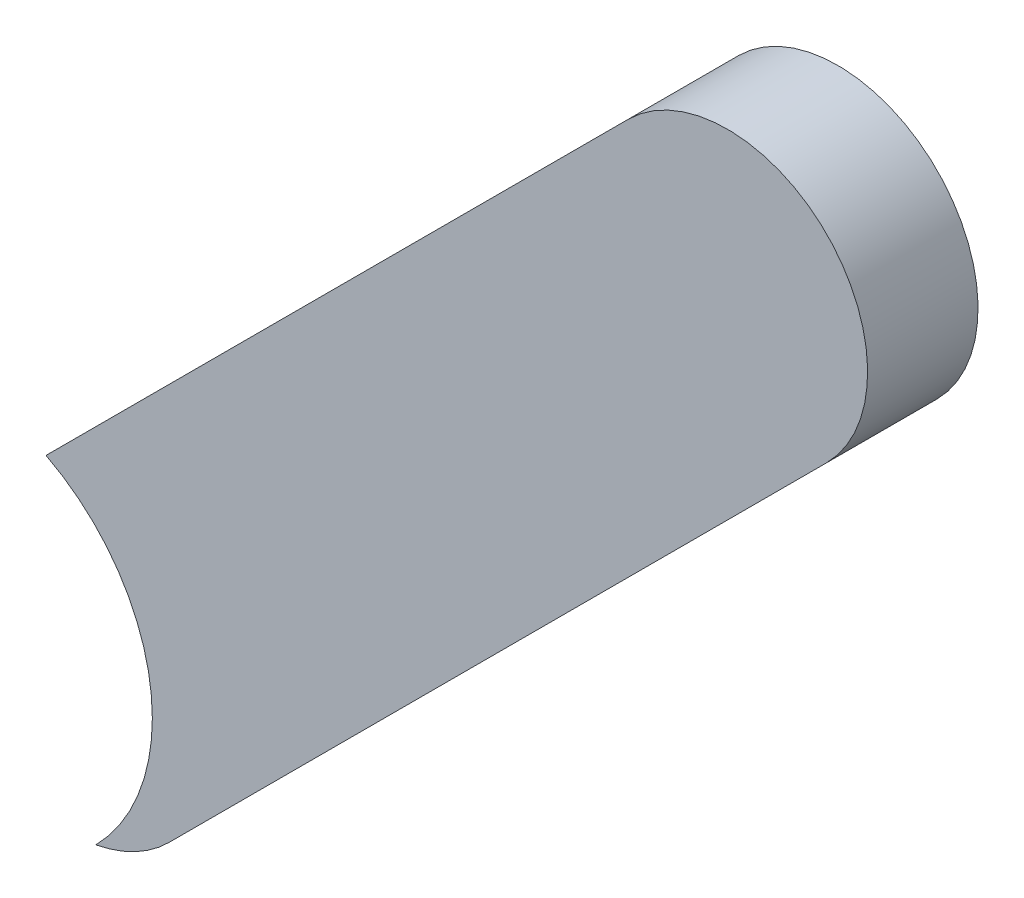
ISO-10303-21;
HEADER;
FILE_DESCRIPTION(('STEP AP214'),'2;1');
FILE_NAME('part.step','',(''),(''),'','','');
FILE_SCHEMA(('AUTOMOTIVE_DESIGN { 1 0 10303 214 1 1 1 1 }'));
ENDSEC;
DATA;
#1=APPLICATION_CONTEXT('core data for automotive mechanical design processes');
#2=APPLICATION_PROTOCOL_DEFINITION('international standard','automotive_design',2000,#1);
#3=PRODUCT_CONTEXT('',#1,'mechanical');
#4=PRODUCT('Part','Part','',(#3));
#5=PRODUCT_RELATED_PRODUCT_CATEGORY('part','',(#4));
#6=PRODUCT_DEFINITION_FORMATION('','',#4);
#7=PRODUCT_DEFINITION_CONTEXT('part definition',#1,'design');
#8=PRODUCT_DEFINITION('design','',#6,#7);
#9=PRODUCT_DEFINITION_SHAPE('','',#8);
#10=(LENGTH_UNIT() NAMED_UNIT(*) SI_UNIT(.MILLI.,.METRE.));
#11=(NAMED_UNIT(*) PLANE_ANGLE_UNIT() SI_UNIT($,.RADIAN.));
#12=(NAMED_UNIT(*) SI_UNIT($,.STERADIAN.) SOLID_ANGLE_UNIT());
#13=UNCERTAINTY_MEASURE_WITH_UNIT(LENGTH_MEASURE(1.E-05),#10,'distance_accuracy_value','');
#14=(GEOMETRIC_REPRESENTATION_CONTEXT(3) GLOBAL_UNCERTAINTY_ASSIGNED_CONTEXT((#13)) GLOBAL_UNIT_ASSIGNED_CONTEXT((#10,
#11,#12)) REPRESENTATION_CONTEXT('',''));
#15=CARTESIAN_POINT('',(0.,0.,0.));
#16=DIRECTION('',(0.,0.,1.));
#17=DIRECTION('',(1.,0.,0.));
#18=AXIS2_PLACEMENT_3D('',#15,#16,#17);
#19=CARTESIAN_POINT('',(136.5298006,68.90839406,0.));
#20=DIRECTION('',(-0.707106781186556,0.707106781186539,0.));
#21=DIRECTION('',(0.707106781186539,0.707106781186556,0.));
#22=AXIS2_PLACEMENT_3D('',#19,#20,#21);
#23=PLANE('',#22);
#24=DIRECTION('',(0.707106781186539,0.707106781186556,0.));
#25=VECTOR('',#24,1.);
#26=CARTESIAN_POINT('',(136.5298006,68.90839406,0.1999996));
#27=LINE('',#26,#25);
#28=CARTESIAN_POINT('',(136.5298006,68.90839406,0.1999996));
#29=VERTEX_POINT('',#28);
#30=CARTESIAN_POINT('',(137.72060594,70.0991994,0.1999996));
#31=VERTEX_POINT('',#30);
#32=EDGE_CURVE('E11',#29,#31,#27,.T.);
#33=ORIENTED_EDGE('',*,*,#32,.F.);
#34=DIRECTION('',(0.,0.,1.));
#35=VECTOR('',#34,1.);
#36=CARTESIAN_POINT('',(136.5298006,68.90839406,0.));
#37=LINE('',#36,#35);
#38=CARTESIAN_POINT('',(136.5298006,68.90839406,0.));
#39=VERTEX_POINT('',#38);
#40=EDGE_CURVE('E24',#39,#29,#37,.T.);
#41=ORIENTED_EDGE('',*,*,#40,.F.);
#42=DIRECTION('',(0.707106781186539,0.707106781186556,0.));
#43=VECTOR('',#42,1.);
#44=CARTESIAN_POINT('',(136.5298006,68.90839406,0.));
#45=LINE('',#44,#43);
#46=CARTESIAN_POINT('',(137.72060594,70.0991994,0.));
#47=VERTEX_POINT('',#46);
#48=EDGE_CURVE('E89',#39,#47,#45,.T.);
#49=ORIENTED_EDGE('',*,*,#48,.T.);
#50=DIRECTION('',(0.,0.,1.));
#51=VECTOR('',#50,1.);
#52=CARTESIAN_POINT('',(137.72060594,70.0991994,0.));
#53=LINE('',#52,#51);
#54=EDGE_CURVE('E37',#47,#31,#53,.T.);
#55=ORIENTED_EDGE('',*,*,#54,.T.);
#56=EDGE_LOOP('',(#33,#41,#49,#55));
#57=FACE_BOUND('',#56,.T.);
#58=ADVANCED_FACE('F17',(#57),#23,.F.);
#59=CARTESIAN_POINT('',(137.541,70.27880534,0.));
#60=DIRECTION('',(0.,0.,-1.));
#61=DIRECTION('',(0.70710678118652,-0.707106781186576,0.));
#62=AXIS2_PLACEMENT_3D('',#59,#60,#61);
#63=CYLINDRICAL_SURFACE('',#62,0.254001156230774);
#64=CARTESIAN_POINT('',(137.541,70.27880534,0.1999996));
#65=DIRECTION('',(0.,0.,1.));
#66=DIRECTION('',(0.70710678118652,-0.707106781186576,0.));
#67=AXIS2_PLACEMENT_3D('',#64,#65,#66);
#68=CIRCLE('',#67,0.254001156230774);
#69=CARTESIAN_POINT('',(137.36139406,70.45841128,0.1999996));
#70=VERTEX_POINT('',#69);
#71=EDGE_CURVE('E111',#31,#70,#68,.T.);
#72=ORIENTED_EDGE('',*,*,#71,.F.);
#73=ORIENTED_EDGE('',*,*,#54,.F.);
#74=CARTESIAN_POINT('',(137.541,70.27880534,0.));
#75=DIRECTION('',(0.,0.,1.));
#76=DIRECTION('',(0.70710678118652,-0.707106781186576,0.));
#77=AXIS2_PLACEMENT_3D('',#74,#75,#76);
#78=CIRCLE('',#77,0.254001156230774);
#79=CARTESIAN_POINT('',(137.36139406,70.45841128,0.));
#80=VERTEX_POINT('',#79);
#81=EDGE_CURVE('E108',#47,#80,#78,.T.);
#82=ORIENTED_EDGE('',*,*,#81,.T.);
#83=DIRECTION('',(0.,0.,1.));
#84=VECTOR('',#83,1.);
#85=CARTESIAN_POINT('',(137.36139406,70.45841128,0.));
#86=LINE('',#85,#84);
#87=EDGE_CURVE('E106',#80,#70,#86,.T.);
#88=ORIENTED_EDGE('',*,*,#87,.T.);
#89=EDGE_LOOP('',(#72,#73,#82,#88));
#90=FACE_BOUND('',#89,.T.);
#91=ADVANCED_FACE('F118',(#90),#63,.T.);
#92=CARTESIAN_POINT('',(137.36139406,70.45841128,0.));
#93=DIRECTION('',(0.70710678118656,-0.707106781186535,0.));
#94=DIRECTION('',(-0.707106781186535,-0.70710678118656,0.));
#95=AXIS2_PLACEMENT_3D('',#92,#93,#94);
#96=PLANE('',#95);
#97=DIRECTION('',(-0.707106781186535,-0.70710678118656,0.));
#98=VECTOR('',#97,1.);
#99=CARTESIAN_POINT('',(137.36139406,70.45841128,0.1999996));
#100=LINE('',#99,#98);
#101=CARTESIAN_POINT('',(136.307016154056,69.4040333740555,0.1999996));
#102=VERTEX_POINT('',#101);
#103=EDGE_CURVE('E103',#70,#102,#100,.T.);
#104=ORIENTED_EDGE('',*,*,#103,.F.);
#105=ORIENTED_EDGE('',*,*,#87,.F.);
#106=DIRECTION('',(-0.707106781186535,-0.70710678118656,0.));
#107=VECTOR('',#106,1.);
#108=CARTESIAN_POINT('',(137.36139406,70.45841128,0.));
#109=LINE('',#108,#107);
#110=CARTESIAN_POINT('',(136.307016154056,69.4040333740555,0.));
#111=VERTEX_POINT('',#110);
#112=EDGE_CURVE('E100',#80,#111,#109,.T.);
#113=ORIENTED_EDGE('',*,*,#112,.T.);
#114=DIRECTION('',(0.,0.,1.));
#115=VECTOR('',#114,1.);
#116=CARTESIAN_POINT('',(136.307016154056,69.4040333740555,0.));
#117=LINE('',#116,#115);
#118=EDGE_CURVE('E98',#111,#102,#117,.T.);
#119=ORIENTED_EDGE('',*,*,#118,.T.);
#120=EDGE_LOOP('',(#104,#105,#113,#119));
#121=FACE_BOUND('',#120,.T.);
#122=ADVANCED_FACE('F124',(#121),#96,.F.);
#123=CARTESIAN_POINT('',(136.144,69.088,0.));
#124=DIRECTION('',(0.,0.,-1.));
#125=DIRECTION('',(1.,0.,0.));
#126=AXIS2_PLACEMENT_3D('',#123,#124,#125);
#127=CYLINDRICAL_SURFACE('',#126,0.3556);
#128=DIRECTION('',(0.,0.,1.));
#129=VECTOR('',#128,1.);
#130=CARTESIAN_POINT('',(136.4996,69.088,0.));
#131=LINE('',#130,#129);
#132=CARTESIAN_POINT('',(136.4996,69.088,0.));
#133=VERTEX_POINT('',#132);
#134=CARTESIAN_POINT('',(136.4996,69.088,0.1999996));
#135=VERTEX_POINT('',#134);
#136=EDGE_CURVE('E81',#133,#135,#131,.T.);
#137=ORIENTED_EDGE('',*,*,#136,.T.);
#138=CARTESIAN_POINT('',(136.144,69.088,0.1999996));
#139=DIRECTION('',(0.,0.,1.));
#140=DIRECTION('',(1.,0.,0.));
#141=AXIS2_PLACEMENT_3D('',#138,#139,#140);
#142=CIRCLE('',#141,0.3556);
#143=EDGE_CURVE('E94',#135,#102,#142,.T.);
#144=ORIENTED_EDGE('',*,*,#143,.T.);
#145=ORIENTED_EDGE('',*,*,#118,.F.);
#146=CARTESIAN_POINT('',(136.144,69.088,0.));
#147=DIRECTION('',(0.,0.,1.));
#148=DIRECTION('',(1.,0.,0.));
#149=AXIS2_PLACEMENT_3D('',#146,#147,#148);
#150=CIRCLE('',#149,0.3556);
#151=EDGE_CURVE('E75',#133,#111,#150,.T.);
#152=ORIENTED_EDGE('',*,*,#151,.F.);
#153=EDGE_LOOP('',(#137,#144,#145,#152));
#154=FACE_BOUND('',#153,.T.);
#155=ADVANCED_FACE('F126',(#154),#127,.F.);
#156=CARTESIAN_POINT('',(136.144,69.088,0.));
#157=DIRECTION('',(0.,0.,-1.));
#158=DIRECTION('',(1.,0.,0.));
#159=AXIS2_PLACEMENT_3D('',#156,#157,#158);
#160=CYLINDRICAL_SURFACE('',#159,0.3556);
#161=DIRECTION('',(0.,0.,1.));
#162=VECTOR('',#161,1.);
#163=CARTESIAN_POINT('',(136.397282530319,68.8384016830276,0.));
#164=LINE('',#163,#162);
#165=CARTESIAN_POINT('',(136.397282530319,68.8384016830276,0.));
#166=VERTEX_POINT('',#165);
#167=CARTESIAN_POINT('',(136.397282530319,68.8384016830276,0.1999996));
#168=VERTEX_POINT('',#167);
#169=EDGE_CURVE('E65',#166,#168,#164,.T.);
#170=ORIENTED_EDGE('',*,*,#169,.T.);
#171=CARTESIAN_POINT('',(136.144,69.088,0.1999996));
#172=DIRECTION('',(0.,0.,1.));
#173=DIRECTION('',(1.,0.,0.));
#174=AXIS2_PLACEMENT_3D('',#171,#172,#173);
#175=CIRCLE('',#174,0.3556);
#176=EDGE_CURVE('E76',#168,#135,#175,.T.);
#177=ORIENTED_EDGE('',*,*,#176,.T.);
#178=ORIENTED_EDGE('',*,*,#136,.F.);
#179=EDGE_CURVE('E79',#166,#133,#150,.T.);
#180=ORIENTED_EDGE('',*,*,#179,.F.);
#181=EDGE_LOOP('',(#170,#177,#178,#180));
#182=FACE_BOUND('',#181,.T.);
#183=ADVANCED_FACE('F80',(#182),#160,.F.);
#184=CARTESIAN_POINT('',(136.35019466,69.088,0.));
#185=DIRECTION('',(0.,0.,-1.));
#186=DIRECTION('',(-0.70710678118652,0.707106781186576,0.));
#187=AXIS2_PLACEMENT_3D('',#184,#185,#186);
#188=CYLINDRICAL_SURFACE('',#187,0.254001156230768);
#189=CARTESIAN_POINT('',(136.35019466,69.088,0.1999996));
#190=DIRECTION('',(0.,0.,1.));
#191=DIRECTION('',(-0.70710678118652,0.707106781186576,0.));
#192=AXIS2_PLACEMENT_3D('',#189,#190,#191);
#193=CIRCLE('',#192,0.254001156230768);
#194=EDGE_CURVE('E71',#168,#29,#193,.T.);
#195=ORIENTED_EDGE('',*,*,#194,.F.);
#196=ORIENTED_EDGE('',*,*,#169,.F.);
#197=CARTESIAN_POINT('',(136.35019466,69.088,0.));
#198=DIRECTION('',(0.,0.,1.));
#199=DIRECTION('',(-0.70710678118652,0.707106781186576,0.));
#200=AXIS2_PLACEMENT_3D('',#197,#198,#199);
#201=CIRCLE('',#200,0.254001156230768);
#202=EDGE_CURVE('E69',#166,#39,#201,.T.);
#203=ORIENTED_EDGE('',*,*,#202,.T.);
#204=ORIENTED_EDGE('',*,*,#40,.T.);
#205=EDGE_LOOP('',(#195,#196,#203,#204));
#206=FACE_BOUND('',#205,.T.);
#207=ADVANCED_FACE('F67',(#206),#188,.T.);
#208=CARTESIAN_POINT('',(136.5298006,68.90839406,0.));
#209=DIRECTION('',(0.,0.,-1.));
#210=DIRECTION('',(-1.,0.,0.));
#211=AXIS2_PLACEMENT_3D('',#208,#209,#210);
#212=PLANE('',#211);
#213=ORIENTED_EDGE('',*,*,#48,.F.);
#214=ORIENTED_EDGE('',*,*,#202,.F.);
#215=ORIENTED_EDGE('',*,*,#179,.T.);
#216=ORIENTED_EDGE('',*,*,#151,.T.);
#217=ORIENTED_EDGE('',*,*,#112,.F.);
#218=ORIENTED_EDGE('',*,*,#81,.F.);
#219=EDGE_LOOP('',(#213,#214,#215,#216,#217,#218));
#220=FACE_BOUND('',#219,.T.);
#221=ADVANCED_FACE('F87',(#220),#212,.T.);
#222=CARTESIAN_POINT('',(136.5298006,68.90839406,0.1999996));
#223=DIRECTION('',(0.,0.,-1.));
#224=DIRECTION('',(-1.,0.,0.));
#225=AXIS2_PLACEMENT_3D('',#222,#223,#224);
#226=PLANE('',#225);
#227=ORIENTED_EDGE('',*,*,#194,.T.);
#228=ORIENTED_EDGE('',*,*,#32,.T.);
#229=ORIENTED_EDGE('',*,*,#71,.T.);
#230=ORIENTED_EDGE('',*,*,#103,.T.);
#231=ORIENTED_EDGE('',*,*,#143,.F.);
#232=ORIENTED_EDGE('',*,*,#176,.F.);
#233=EDGE_LOOP('',(#227,#228,#229,#230,#231,#232));
#234=FACE_BOUND('',#233,.T.);
#235=ADVANCED_FACE('F121',(#234),#226,.F.);
#236=CLOSED_SHELL('',(#58,#91,#122,#155,#183,#207,#221,#235));
#237=MANIFOLD_SOLID_BREP('B1',#236);
#238=ADVANCED_BREP_SHAPE_REPRESENTATION('',(#18,#237),#14);
#239=SHAPE_DEFINITION_REPRESENTATION(#9,#238);
ENDSEC;
END-ISO-10303-21;
